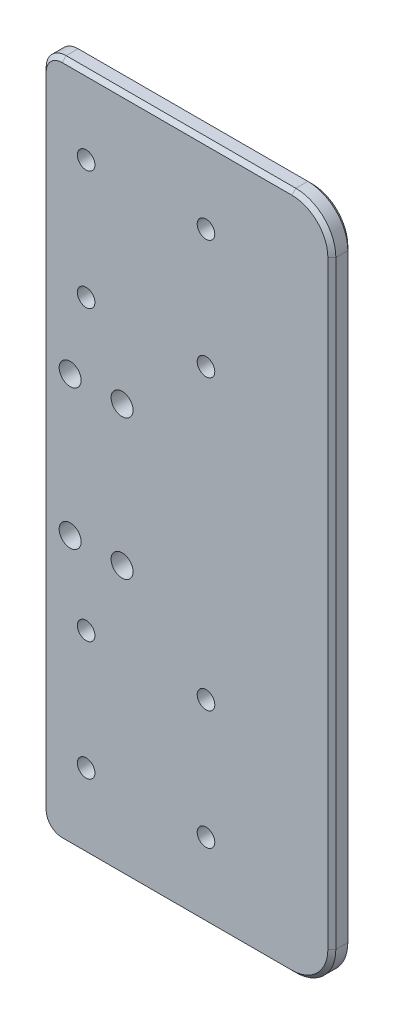
ISO-10303-21;
HEADER;
FILE_DESCRIPTION(('STEP AP214'),'2;1');
FILE_NAME('part.step','',(''),(''),'','','');
FILE_SCHEMA(('AUTOMOTIVE_DESIGN { 1 0 10303 214 1 1 1 1 }'));
ENDSEC;
DATA;
#1=APPLICATION_CONTEXT('core data for automotive mechanical design processes');
#2=APPLICATION_PROTOCOL_DEFINITION('international standard','automotive_design',2000,#1);
#3=PRODUCT_CONTEXT('',#1,'mechanical');
#4=PRODUCT('Part','Part','',(#3));
#5=PRODUCT_RELATED_PRODUCT_CATEGORY('part','',(#4));
#6=PRODUCT_DEFINITION_FORMATION('','',#4);
#7=PRODUCT_DEFINITION_CONTEXT('part definition',#1,'design');
#8=PRODUCT_DEFINITION('design','',#6,#7);
#9=PRODUCT_DEFINITION_SHAPE('','',#8);
#10=(LENGTH_UNIT() NAMED_UNIT(*) SI_UNIT(.MILLI.,.METRE.));
#11=(NAMED_UNIT(*) PLANE_ANGLE_UNIT() SI_UNIT($,.RADIAN.));
#12=(NAMED_UNIT(*) SI_UNIT($,.STERADIAN.) SOLID_ANGLE_UNIT());
#13=UNCERTAINTY_MEASURE_WITH_UNIT(LENGTH_MEASURE(1.E-05),#10,'distance_accuracy_value','');
#14=(GEOMETRIC_REPRESENTATION_CONTEXT(3) GLOBAL_UNCERTAINTY_ASSIGNED_CONTEXT((#13)) GLOBAL_UNIT_ASSIGNED_CONTEXT((#10,
#11,#12)) REPRESENTATION_CONTEXT('',''));
#15=CARTESIAN_POINT('',(0.,0.,0.));
#16=DIRECTION('',(0.,0.,1.));
#17=DIRECTION('',(1.,0.,0.));
#18=AXIS2_PLACEMENT_3D('',#15,#16,#17);
#19=CARTESIAN_POINT('',(234.824487649167,0.,-5.));
#20=DIRECTION('',(-1.,0.,0.));
#21=DIRECTION('',(0.,0.,1.));
#22=AXIS2_PLACEMENT_3D('',#19,#20,#21);
#23=PLANE('',#22);
#24=DIRECTION('',(0.,0.,1.));
#25=VECTOR('',#24,1.);
#26=CARTESIAN_POINT('',(234.824487649167,-3.00000303575964,-5.));
#27=LINE('',#26,#25);
#28=CARTESIAN_POINT('',(234.824487649167,-3.00000303575964,-4.));
#29=VERTEX_POINT('',#28);
#30=CARTESIAN_POINT('',(234.824487649167,-3.00000303575964,-1.));
#31=VERTEX_POINT('',#30);
#32=EDGE_CURVE('E323',#29,#31,#27,.T.);
#33=ORIENTED_EDGE('',*,*,#32,.T.);
#34=DIRECTION('',(0.,-1.,0.));
#35=VECTOR('',#34,1.);
#36=CARTESIAN_POINT('',(234.824487649167,-152.999988315742,-1.));
#37=LINE('',#36,#35);
#38=CARTESIAN_POINT('',(234.824487649167,-152.999988315742,-1.));
#39=VERTEX_POINT('',#38);
#40=EDGE_CURVE('E384',#31,#39,#37,.T.);
#41=ORIENTED_EDGE('',*,*,#40,.T.);
#42=DIRECTION('',(0.,0.,1.));
#43=VECTOR('',#42,1.);
#44=CARTESIAN_POINT('',(234.824487649167,-152.999988315742,-5.));
#45=LINE('',#44,#43);
#46=CARTESIAN_POINT('',(234.824487649167,-152.999988315742,-4.));
#47=VERTEX_POINT('',#46);
#48=EDGE_CURVE('E188',#47,#39,#45,.T.);
#49=ORIENTED_EDGE('',*,*,#48,.F.);
#50=DIRECTION('',(0.,1.,0.));
#51=VECTOR('',#50,1.);
#52=CARTESIAN_POINT('',(234.824487649167,0.,-4.));
#53=LINE('',#52,#51);
#54=EDGE_CURVE('E382',#47,#29,#53,.T.);
#55=ORIENTED_EDGE('',*,*,#54,.T.);
#56=EDGE_LOOP('',(#33,#41,#49,#55));
#57=FACE_BOUND('',#56,.T.);
#58=ADVANCED_FACE('F44',(#57),#23,.F.);
#59=CARTESIAN_POINT('',(224.824487649167,-152.999988315742,-5.));
#60=DIRECTION('',(0.,0.,1.));
#61=DIRECTION('',(1.,0.,0.));
#62=AXIS2_PLACEMENT_3D('',#59,#60,#61);
#63=CYLINDRICAL_SURFACE('',#62,10.);
#64=ORIENTED_EDGE('',*,*,#48,.T.);
#65=CARTESIAN_POINT('',(224.824487649167,-152.999988315742,-1.));
#66=DIRECTION('',(0.,0.,1.));
#67=DIRECTION('',(1.,0.,0.));
#68=AXIS2_PLACEMENT_3D('',#65,#66,#67);
#69=CIRCLE('',#68,10.);
#70=CARTESIAN_POINT('',(224.824489681212,-162.999988315742,-1.));
#71=VERTEX_POINT('',#70);
#72=EDGE_CURVE('E378',#39,#71,#69,.F.);
#73=ORIENTED_EDGE('',*,*,#72,.T.);
#74=DIRECTION('',(0.,0.,1.));
#75=VECTOR('',#74,1.);
#76=CARTESIAN_POINT('',(224.824489681212,-162.999988315742,-5.));
#77=LINE('',#76,#75);
#78=CARTESIAN_POINT('',(224.824489681212,-162.999988315742,-4.));
#79=VERTEX_POINT('',#78);
#80=EDGE_CURVE('E327',#79,#71,#77,.T.);
#81=ORIENTED_EDGE('',*,*,#80,.F.);
#82=CARTESIAN_POINT('',(224.824487649167,-152.999988315742,-4.));
#83=DIRECTION('',(0.,0.,1.));
#84=DIRECTION('',(1.,0.,0.));
#85=AXIS2_PLACEMENT_3D('',#82,#83,#84);
#86=CIRCLE('',#85,10.);
#87=EDGE_CURVE('E380',#79,#47,#86,.T.);
#88=ORIENTED_EDGE('',*,*,#87,.T.);
#89=EDGE_LOOP('',(#64,#73,#81,#88));
#90=FACE_BOUND('',#89,.T.);
#91=ADVANCED_FACE('F444',(#90),#63,.T.);
#92=CARTESIAN_POINT('',(3.31223389725105E-05,-163.000034001081,-5.));
#93=DIRECTION('',(-2.03204491186119E-07,0.999999999999979,0.));
#94=DIRECTION('',(-0.999999999999979,-2.03204491186119E-07,0.));
#95=AXIS2_PLACEMENT_3D('',#92,#93,#94);
#96=PLANE('',#95);
#97=ORIENTED_EDGE('',*,*,#80,.T.);
#98=DIRECTION('',(-0.999999999999979,-2.03204491186119E-07,0.));
#99=VECTOR('',#98,1.);
#100=CARTESIAN_POINT('',(167.32448866519,-163.,-1.));
#101=LINE('',#100,#99);
#102=CARTESIAN_POINT('',(167.32448866519,-163.,-1.));
#103=VERTEX_POINT('',#102);
#104=EDGE_CURVE('E371',#71,#103,#101,.T.);
#105=ORIENTED_EDGE('',*,*,#104,.T.);
#106=DIRECTION('',(0.,0.,1.));
#107=VECTOR('',#106,1.);
#108=CARTESIAN_POINT('',(167.32448866519,-163.,-5.));
#109=LINE('',#108,#107);
#110=CARTESIAN_POINT('',(167.32448866519,-163.,-4.));
#111=VERTEX_POINT('',#110);
#112=EDGE_CURVE('E334',#111,#103,#109,.T.);
#113=ORIENTED_EDGE('',*,*,#112,.F.);
#114=DIRECTION('',(0.999999999999979,2.03204491186119E-07,0.));
#115=VECTOR('',#114,1.);
#116=CARTESIAN_POINT('',(3.31223389725105E-05,-163.000034001081,-4.));
#117=LINE('',#116,#115);
#118=EDGE_CURVE('E367',#111,#79,#117,.T.);
#119=ORIENTED_EDGE('',*,*,#118,.T.);
#120=EDGE_LOOP('',(#97,#105,#113,#119));
#121=FACE_BOUND('',#120,.T.);
#122=ADVANCED_FACE('F420',(#121),#96,.F.);
#123=CARTESIAN_POINT('',(167.324487649167,-158.,-5.));
#124=DIRECTION('',(0.,0.,1.));
#125=DIRECTION('',(1.,0.,0.));
#126=AXIS2_PLACEMENT_3D('',#123,#124,#125);
#127=CYLINDRICAL_SURFACE('',#126,5.);
#128=ORIENTED_EDGE('',*,*,#112,.T.);
#129=CARTESIAN_POINT('',(167.324487649167,-158.,-1.));
#130=DIRECTION('',(0.,0.,1.));
#131=DIRECTION('',(1.,0.,0.));
#132=AXIS2_PLACEMENT_3D('',#129,#130,#131);
#133=CIRCLE('',#132,5.);
#134=CARTESIAN_POINT('',(162.324487649167,-158.,-1.));
#135=VERTEX_POINT('',#134);
#136=EDGE_CURVE('E361',#103,#135,#133,.F.);
#137=ORIENTED_EDGE('',*,*,#136,.T.);
#138=DIRECTION('',(0.,0.,1.));
#139=VECTOR('',#138,1.);
#140=CARTESIAN_POINT('',(162.324487649167,-158.,-5.));
#141=LINE('',#140,#139);
#142=CARTESIAN_POINT('',(162.324487649167,-158.,-4.));
#143=VERTEX_POINT('',#142);
#144=EDGE_CURVE('E184',#143,#135,#141,.T.);
#145=ORIENTED_EDGE('',*,*,#144,.F.);
#146=CARTESIAN_POINT('',(167.324487649167,-158.,-4.));
#147=DIRECTION('',(0.,0.,1.));
#148=DIRECTION('',(1.,0.,0.));
#149=AXIS2_PLACEMENT_3D('',#146,#147,#148);
#150=CIRCLE('',#149,5.);
#151=EDGE_CURVE('E363',#143,#111,#150,.T.);
#152=ORIENTED_EDGE('',*,*,#151,.T.);
#153=EDGE_LOOP('',(#128,#137,#145,#152));
#154=FACE_BOUND('',#153,.T.);
#155=ADVANCED_FACE('F417',(#154),#127,.T.);
#156=CARTESIAN_POINT('',(162.324487649167,0.,-5.));
#157=DIRECTION('',(1.,0.,0.));
#158=DIRECTION('',(0.,0.,-1.));
#159=AXIS2_PLACEMENT_3D('',#156,#157,#158);
#160=PLANE('',#159);
#161=ORIENTED_EDGE('',*,*,#144,.T.);
#162=DIRECTION('',(0.,1.,0.));
#163=VECTOR('',#162,1.);
#164=CARTESIAN_POINT('',(162.324487649167,1.99999999999995,-1.));
#165=LINE('',#164,#163);
#166=CARTESIAN_POINT('',(162.324487649167,1.99999999999995,-1.));
#167=VERTEX_POINT('',#166);
#168=EDGE_CURVE('E183',#135,#167,#165,.T.);
#169=ORIENTED_EDGE('',*,*,#168,.T.);
#170=DIRECTION('',(0.,0.,1.));
#171=VECTOR('',#170,1.);
#172=CARTESIAN_POINT('',(162.324487649167,1.99999999999995,-5.));
#173=LINE('',#172,#171);
#174=CARTESIAN_POINT('',(162.324487649167,1.99999999999995,-4.));
#175=VERTEX_POINT('',#174);
#176=EDGE_CURVE('E170',#175,#167,#173,.T.);
#177=ORIENTED_EDGE('',*,*,#176,.F.);
#178=DIRECTION('',(0.,-1.,0.));
#179=VECTOR('',#178,1.);
#180=CARTESIAN_POINT('',(162.324487649167,0.,-4.));
#181=LINE('',#180,#179);
#182=EDGE_CURVE('E181',#175,#143,#181,.T.);
#183=ORIENTED_EDGE('',*,*,#182,.T.);
#184=EDGE_LOOP('',(#161,#169,#177,#183));
#185=FACE_BOUND('',#184,.T.);
#186=ADVANCED_FACE('F179',(#185),#160,.F.);
#187=CARTESIAN_POINT('',(167.324487649167,1.99999999999995,-5.));
#188=DIRECTION('',(0.,0.,1.));
#189=DIRECTION('',(1.,0.,0.));
#190=AXIS2_PLACEMENT_3D('',#187,#188,#189);
#191=CYLINDRICAL_SURFACE('',#190,5.);
#192=ORIENTED_EDGE('',*,*,#176,.T.);
#193=CARTESIAN_POINT('',(167.324487649167,1.99999999999995,-1.));
#194=DIRECTION('',(0.,0.,1.));
#195=DIRECTION('',(1.,0.,0.));
#196=AXIS2_PLACEMENT_3D('',#193,#194,#195);
#197=CIRCLE('',#196,5.);
#198=CARTESIAN_POINT('',(167.324487913146,6.99999999999995,-1.));
#199=VERTEX_POINT('',#198);
#200=EDGE_CURVE('E173',#167,#199,#197,.F.);
#201=ORIENTED_EDGE('',*,*,#200,.T.);
#202=DIRECTION('',(0.,0.,1.));
#203=VECTOR('',#202,1.);
#204=CARTESIAN_POINT('',(167.324487913146,6.99999999999995,-5.));
#205=LINE('',#204,#203);
#206=CARTESIAN_POINT('',(167.324487913146,6.99999999999995,-4.));
#207=VERTEX_POINT('',#206);
#208=EDGE_CURVE('E169',#207,#199,#205,.T.);
#209=ORIENTED_EDGE('',*,*,#208,.F.);
#210=CARTESIAN_POINT('',(167.324487649167,1.99999999999995,-4.));
#211=DIRECTION('',(0.,0.,1.));
#212=DIRECTION('',(1.,0.,0.));
#213=AXIS2_PLACEMENT_3D('',#210,#211,#212);
#214=CIRCLE('',#213,5.);
#215=EDGE_CURVE('E165',#207,#175,#214,.T.);
#216=ORIENTED_EDGE('',*,*,#215,.T.);
#217=EDGE_LOOP('',(#192,#201,#209,#216));
#218=FACE_BOUND('',#217,.T.);
#219=ADVANCED_FACE('F168',(#218),#191,.T.);
#220=CARTESIAN_POINT('',(3.69571190522047E-07,7.00000883403309,-5.));
#221=DIRECTION('',(-5.27958177317208E-08,-0.999999999999999,0.));
#222=DIRECTION('',(0.999999999999999,-5.27958177317208E-08,0.));
#223=AXIS2_PLACEMENT_3D('',#220,#221,#222);
#224=PLANE('',#223);
#225=ORIENTED_EDGE('',*,*,#208,.T.);
#226=DIRECTION('',(0.999999999999999,-5.27958177317208E-08,0.));
#227=VECTOR('',#226,1.);
#228=CARTESIAN_POINT('',(224.824488177125,6.99999696424041,-1.));
#229=LINE('',#228,#227);
#230=CARTESIAN_POINT('',(224.824488177125,6.99999696424041,-1.));
#231=VERTEX_POINT('',#230);
#232=EDGE_CURVE('E370',#199,#231,#229,.T.);
#233=ORIENTED_EDGE('',*,*,#232,.T.);
#234=DIRECTION('',(0.,0.,1.));
#235=VECTOR('',#234,1.);
#236=CARTESIAN_POINT('',(224.824488177125,6.99999696424041,-5.));
#237=LINE('',#236,#235);
#238=CARTESIAN_POINT('',(224.824488177125,6.99999696424041,-4.));
#239=VERTEX_POINT('',#238);
#240=EDGE_CURVE('E336',#239,#231,#237,.T.);
#241=ORIENTED_EDGE('',*,*,#240,.F.);
#242=DIRECTION('',(-0.999999999999999,5.27958177317208E-08,0.));
#243=VECTOR('',#242,1.);
#244=CARTESIAN_POINT('',(3.69571190522047E-07,7.00000883403309,-4.));
#245=LINE('',#244,#243);
#246=EDGE_CURVE('E362',#239,#207,#245,.T.);
#247=ORIENTED_EDGE('',*,*,#246,.T.);
#248=EDGE_LOOP('',(#225,#233,#241,#247));
#249=FACE_BOUND('',#248,.T.);
#250=ADVANCED_FACE('F456',(#249),#224,.F.);
#251=CARTESIAN_POINT('',(224.824487649167,-3.00000303575957,-5.));
#252=DIRECTION('',(0.,0.,1.));
#253=DIRECTION('',(1.,0.,0.));
#254=AXIS2_PLACEMENT_3D('',#251,#252,#253);
#255=CYLINDRICAL_SURFACE('',#254,10.);
#256=ORIENTED_EDGE('',*,*,#240,.T.);
#257=CARTESIAN_POINT('',(224.824487649167,-3.00000303575957,-1.));
#258=DIRECTION('',(0.,0.,1.));
#259=DIRECTION('',(1.,0.,0.));
#260=AXIS2_PLACEMENT_3D('',#257,#258,#259);
#261=CIRCLE('',#260,10.);
#262=EDGE_CURVE('E374',#231,#31,#261,.F.);
#263=ORIENTED_EDGE('',*,*,#262,.T.);
#264=ORIENTED_EDGE('',*,*,#32,.F.);
#265=CARTESIAN_POINT('',(224.824487649167,-3.00000303575957,-4.));
#266=DIRECTION('',(0.,0.,1.));
#267=DIRECTION('',(1.,0.,0.));
#268=AXIS2_PLACEMENT_3D('',#265,#266,#267);
#269=CIRCLE('',#268,10.);
#270=EDGE_CURVE('E373',#29,#239,#269,.T.);
#271=ORIENTED_EDGE('',*,*,#270,.T.);
#272=EDGE_LOOP('',(#256,#263,#264,#271));
#273=FACE_BOUND('',#272,.T.);
#274=ADVANCED_FACE('F451',(#273),#255,.T.);
#275=CARTESIAN_POINT('',(0.,0.,-5.));
#276=DIRECTION('',(0.,0.,1.));
#277=DIRECTION('',(1.,0.,0.));
#278=AXIS2_PLACEMENT_3D('',#275,#276,#277);
#279=PLANE('',#278);
#280=CARTESIAN_POINT('',(167.324487649167,-158.,-5.));
#281=DIRECTION('',(0.,0.,1.));
#282=DIRECTION('',(1.,0.,0.));
#283=AXIS2_PLACEMENT_3D('',#280,#281,#282);
#284=CIRCLE('',#283,4.);
#285=CARTESIAN_POINT('',(167.324488461985,-162.,-5.));
#286=VERTEX_POINT('',#285);
#287=CARTESIAN_POINT('',(163.324487649167,-158.,-5.));
#288=VERTEX_POINT('',#287);
#289=EDGE_CURVE('E67',#286,#288,#284,.F.);
#290=ORIENTED_EDGE('',*,*,#289,.T.);
#291=DIRECTION('',(0.,1.,0.));
#292=VECTOR('',#291,1.);
#293=CARTESIAN_POINT('',(163.324487649167,0.,-5.));
#294=LINE('',#293,#292);
#295=CARTESIAN_POINT('',(163.324487649167,1.99999999999995,-5.));
#296=VERTEX_POINT('',#295);
#297=EDGE_CURVE('E11',#288,#296,#294,.T.);
#298=ORIENTED_EDGE('',*,*,#297,.T.);
#299=CARTESIAN_POINT('',(167.324487649167,1.99999999999995,-5.));
#300=DIRECTION('',(0.,0.,1.));
#301=DIRECTION('',(1.,0.,0.));
#302=AXIS2_PLACEMENT_3D('',#299,#300,#301);
#303=CIRCLE('',#302,4.);
#304=CARTESIAN_POINT('',(167.324487860351,5.99999999999995,-5.));
#305=VERTEX_POINT('',#304);
#306=EDGE_CURVE('E54',#296,#305,#303,.F.);
#307=ORIENTED_EDGE('',*,*,#306,.T.);
#308=DIRECTION('',(0.999999999999999,-5.27958177317208E-08,0.));
#309=VECTOR('',#308,1.);
#310=CARTESIAN_POINT('',(3.16775372790326E-07,6.00000883403309,-5.));
#311=LINE('',#310,#309);
#312=CARTESIAN_POINT('',(224.824488124329,5.99999696424042,-5.));
#313=VERTEX_POINT('',#312);
#314=EDGE_CURVE('E395',#305,#313,#311,.T.);
#315=ORIENTED_EDGE('',*,*,#314,.T.);
#316=CARTESIAN_POINT('',(224.824487649167,-3.00000303575957,-5.));
#317=DIRECTION('',(0.,0.,1.));
#318=DIRECTION('',(1.,0.,0.));
#319=AXIS2_PLACEMENT_3D('',#316,#317,#318);
#320=CIRCLE('',#319,9.00000000000001);
#321=CARTESIAN_POINT('',(233.824487649167,-3.00000303575964,-5.));
#322=VERTEX_POINT('',#321);
#323=EDGE_CURVE('E386',#313,#322,#320,.F.);
#324=ORIENTED_EDGE('',*,*,#323,.T.);
#325=DIRECTION('',(0.,-1.,0.));
#326=VECTOR('',#325,1.);
#327=CARTESIAN_POINT('',(233.824487649167,0.,-5.));
#328=LINE('',#327,#326);
#329=CARTESIAN_POINT('',(233.824487649167,-152.999988315742,-5.));
#330=VERTEX_POINT('',#329);
#331=EDGE_CURVE('E383',#322,#330,#328,.T.);
#332=ORIENTED_EDGE('',*,*,#331,.T.);
#333=CARTESIAN_POINT('',(224.824487649167,-152.999988315742,-5.));
#334=DIRECTION('',(0.,0.,1.));
#335=DIRECTION('',(1.,0.,0.));
#336=AXIS2_PLACEMENT_3D('',#333,#334,#335);
#337=CIRCLE('',#336,9.);
#338=CARTESIAN_POINT('',(224.824489478008,-161.999988315742,-5.));
#339=VERTEX_POINT('',#338);
#340=EDGE_CURVE('E390',#330,#339,#337,.F.);
#341=ORIENTED_EDGE('',*,*,#340,.T.);
#342=DIRECTION('',(-0.999999999999979,-2.03204491186119E-07,0.));
#343=VECTOR('',#342,1.);
#344=CARTESIAN_POINT('',(3.29191344813243E-05,-162.000034001081,-5.));
#345=LINE('',#344,#343);
#346=EDGE_CURVE('E394',#339,#286,#345,.T.);
#347=ORIENTED_EDGE('',*,*,#346,.T.);
#348=EDGE_LOOP('',(#290,#298,#307,#315,#324,#332,#341,#347));
#349=FACE_BOUND('',#348,.T.);
#350=CARTESIAN_POINT('',(203.324487649168,-143.9,-5.));
#351=DIRECTION('',(0.,0.,1.));
#352=DIRECTION('',(1.,0.,0.));
#353=AXIS2_PLACEMENT_3D('',#350,#351,#352);
#354=CIRCLE('',#353,2.19999999999999);
#355=CARTESIAN_POINT('',(205.524487649168,-143.9,-5.));
#356=VERTEX_POINT('',#355);
#357=EDGE_CURVE('E290',#356,#356,#354,.T.);
#358=ORIENTED_EDGE('',*,*,#357,.T.);
#359=EDGE_LOOP('',(#358));
#360=FACE_BOUND('',#359,.T.);
#361=CARTESIAN_POINT('',(173.324487649168,-114.1,-5.));
#362=DIRECTION('',(0.,0.,1.));
#363=DIRECTION('',(1.,0.,0.));
#364=AXIS2_PLACEMENT_3D('',#361,#362,#363);
#365=CIRCLE('',#364,2.19999999999998);
#366=CARTESIAN_POINT('',(175.524487649168,-114.1,-5.));
#367=VERTEX_POINT('',#366);
#368=EDGE_CURVE('E280',#367,#367,#365,.T.);
#369=ORIENTED_EDGE('',*,*,#368,.T.);
#370=EDGE_LOOP('',(#369));
#371=FACE_BOUND('',#370,.T.);
#372=CARTESIAN_POINT('',(203.324487649168,-114.1,-5.));
#373=DIRECTION('',(0.,0.,1.));
#374=DIRECTION('',(1.,0.,0.));
#375=AXIS2_PLACEMENT_3D('',#372,#373,#374);
#376=CIRCLE('',#375,2.20000000000001);
#377=CARTESIAN_POINT('',(205.524487649168,-114.1,-5.));
#378=VERTEX_POINT('',#377);
#379=EDGE_CURVE('E279',#378,#378,#376,.T.);
#380=ORIENTED_EDGE('',*,*,#379,.T.);
#381=EDGE_LOOP('',(#380));
#382=FACE_BOUND('',#381,.T.);
#383=CARTESIAN_POINT('',(169.324487649167,-60.5000000000001,-5.));
#384=DIRECTION('',(0.,0.,1.));
#385=DIRECTION('',(1.,0.,0.));
#386=AXIS2_PLACEMENT_3D('',#383,#384,#385);
#387=CIRCLE('',#386,2.75000000000001);
#388=CARTESIAN_POINT('',(172.074487649167,-60.5000000000001,-5.));
#389=VERTEX_POINT('',#388);
#390=EDGE_CURVE('E262',#389,#389,#387,.T.);
#391=ORIENTED_EDGE('',*,*,#390,.T.);
#392=EDGE_LOOP('',(#391));
#393=FACE_BOUND('',#392,.T.);
#394=CARTESIAN_POINT('',(173.324487649167,-12.0999999999999,-5.));
#395=DIRECTION('',(0.,0.,1.));
#396=DIRECTION('',(1.,0.,0.));
#397=AXIS2_PLACEMENT_3D('',#394,#395,#396);
#398=CIRCLE('',#397,2.20000000000001);
#399=CARTESIAN_POINT('',(175.524487649167,-12.0999999999999,-5.));
#400=VERTEX_POINT('',#399);
#401=EDGE_CURVE('E313',#400,#400,#398,.T.);
#402=ORIENTED_EDGE('',*,*,#401,.T.);
#403=EDGE_LOOP('',(#402));
#404=FACE_BOUND('',#403,.T.);
#405=CARTESIAN_POINT('',(173.324487649167,-41.8999999999999,-5.));
#406=DIRECTION('',(0.,0.,1.));
#407=DIRECTION('',(1.,0.,0.));
#408=AXIS2_PLACEMENT_3D('',#405,#406,#407);
#409=CIRCLE('',#408,2.20000000000001);
#410=CARTESIAN_POINT('',(175.524487649167,-41.8999999999999,-5.));
#411=VERTEX_POINT('',#410);
#412=EDGE_CURVE('E301',#411,#411,#409,.T.);
#413=ORIENTED_EDGE('',*,*,#412,.T.);
#414=EDGE_LOOP('',(#413));
#415=FACE_BOUND('',#414,.T.);
#416=CARTESIAN_POINT('',(203.324487649167,-41.8999999999999,-5.));
#417=DIRECTION('',(0.,0.,1.));
#418=DIRECTION('',(1.,0.,0.));
#419=AXIS2_PLACEMENT_3D('',#416,#417,#418);
#420=CIRCLE('',#419,2.19999999999999);
#421=CARTESIAN_POINT('',(205.524487649167,-41.8999999999999,-5.));
#422=VERTEX_POINT('',#421);
#423=EDGE_CURVE('E305',#422,#422,#420,.T.);
#424=ORIENTED_EDGE('',*,*,#423,.T.);
#425=EDGE_LOOP('',(#424));
#426=FACE_BOUND('',#425,.T.);
#427=CARTESIAN_POINT('',(173.324487649168,-143.9,-5.));
#428=DIRECTION('',(0.,0.,1.));
#429=DIRECTION('',(1.,0.,0.));
#430=AXIS2_PLACEMENT_3D('',#427,#428,#429);
#431=CIRCLE('',#430,2.19999999999999);
#432=CARTESIAN_POINT('',(175.524487649168,-143.9,-5.));
#433=VERTEX_POINT('',#432);
#434=EDGE_CURVE('E288',#433,#433,#431,.T.);
#435=ORIENTED_EDGE('',*,*,#434,.T.);
#436=EDGE_LOOP('',(#435));
#437=FACE_BOUND('',#436,.T.);
#438=CARTESIAN_POINT('',(182.324487649167,-95.5000000000001,-5.));
#439=DIRECTION('',(0.,0.,1.));
#440=DIRECTION('',(1.,0.,0.));
#441=AXIS2_PLACEMENT_3D('',#438,#439,#440);
#442=CIRCLE('',#441,2.75000000000001);
#443=CARTESIAN_POINT('',(185.074487649167,-95.5000000000001,-5.));
#444=VERTEX_POINT('',#443);
#445=EDGE_CURVE('E247',#444,#444,#442,.T.);
#446=ORIENTED_EDGE('',*,*,#445,.T.);
#447=EDGE_LOOP('',(#446));
#448=FACE_BOUND('',#447,.T.);
#449=CARTESIAN_POINT('',(182.324487649167,-60.5000000000001,-5.));
#450=DIRECTION('',(0.,0.,1.));
#451=DIRECTION('',(1.,0.,0.));
#452=AXIS2_PLACEMENT_3D('',#449,#450,#451);
#453=CIRCLE('',#452,2.74999999999998);
#454=CARTESIAN_POINT('',(185.074487649167,-60.5000000000001,-5.));
#455=VERTEX_POINT('',#454);
#456=EDGE_CURVE('E256',#455,#455,#453,.T.);
#457=ORIENTED_EDGE('',*,*,#456,.T.);
#458=EDGE_LOOP('',(#457));
#459=FACE_BOUND('',#458,.T.);
#460=CARTESIAN_POINT('',(169.324487649167,-95.5000000000001,-5.));
#461=DIRECTION('',(0.,0.,1.));
#462=DIRECTION('',(1.,0.,0.));
#463=AXIS2_PLACEMENT_3D('',#460,#461,#462);
#464=CIRCLE('',#463,2.74999999999998);
#465=CARTESIAN_POINT('',(172.074487649167,-95.5000000000001,-5.));
#466=VERTEX_POINT('',#465);
#467=EDGE_CURVE('E266',#466,#466,#464,.T.);
#468=ORIENTED_EDGE('',*,*,#467,.T.);
#469=EDGE_LOOP('',(#468));
#470=FACE_BOUND('',#469,.T.);
#471=CARTESIAN_POINT('',(203.324487649167,-12.0999999999999,-5.));
#472=DIRECTION('',(0.,0.,1.));
#473=DIRECTION('',(1.,0.,0.));
#474=AXIS2_PLACEMENT_3D('',#471,#472,#473);
#475=CIRCLE('',#474,2.19999999999998);
#476=CARTESIAN_POINT('',(205.524487649167,-12.0999999999999,-5.));
#477=VERTEX_POINT('',#476);
#478=EDGE_CURVE('E325',#477,#477,#475,.T.);
#479=ORIENTED_EDGE('',*,*,#478,.T.);
#480=EDGE_LOOP('',(#479));
#481=FACE_BOUND('',#480,.T.);
#482=ADVANCED_FACE('F396',(#349,#360,#371,#382,#393,#404,#415,#426,#437,#448,#459,#470,#481),
#279,.F.);
#483=CARTESIAN_POINT('',(0.,0.,0.));
#484=DIRECTION('',(0.,0.,1.));
#485=DIRECTION('',(1.,0.,0.));
#486=AXIS2_PLACEMENT_3D('',#483,#484,#485);
#487=PLANE('',#486);
#488=CARTESIAN_POINT('',(167.324487649167,1.99999999999995,0.));
#489=DIRECTION('',(0.,0.,1.));
#490=DIRECTION('',(1.,0.,0.));
#491=AXIS2_PLACEMENT_3D('',#488,#489,#490);
#492=CIRCLE('',#491,4.);
#493=CARTESIAN_POINT('',(167.324487860351,5.99999999999995,0.));
#494=VERTEX_POINT('',#493);
#495=CARTESIAN_POINT('',(163.324487649167,1.99999999999995,0.));
#496=VERTEX_POINT('',#495);
#497=EDGE_CURVE('E358',#494,#496,#492,.T.);
#498=ORIENTED_EDGE('',*,*,#497,.T.);
#499=DIRECTION('',(0.,-1.,0.));
#500=VECTOR('',#499,1.);
#501=CARTESIAN_POINT('',(163.324487649167,-158.,0.));
#502=LINE('',#501,#500);
#503=CARTESIAN_POINT('',(163.324487649167,-158.,0.));
#504=VERTEX_POINT('',#503);
#505=EDGE_CURVE('E172',#496,#504,#502,.T.);
#506=ORIENTED_EDGE('',*,*,#505,.T.);
#507=CARTESIAN_POINT('',(167.324487649167,-158.,0.));
#508=DIRECTION('',(0.,0.,1.));
#509=DIRECTION('',(1.,0.,0.));
#510=AXIS2_PLACEMENT_3D('',#507,#508,#509);
#511=CIRCLE('',#510,4.);
#512=CARTESIAN_POINT('',(167.324488461985,-162.,0.));
#513=VERTEX_POINT('',#512);
#514=EDGE_CURVE('E353',#504,#513,#511,.T.);
#515=ORIENTED_EDGE('',*,*,#514,.T.);
#516=DIRECTION('',(0.999999999999979,2.03204491186119E-07,0.));
#517=VECTOR('',#516,1.);
#518=CARTESIAN_POINT('',(224.824489478007,-161.999988315742,0.));
#519=LINE('',#518,#517);
#520=CARTESIAN_POINT('',(224.824489478008,-161.999988315742,0.));
#521=VERTEX_POINT('',#520);
#522=EDGE_CURVE('E347',#513,#521,#519,.T.);
#523=ORIENTED_EDGE('',*,*,#522,.T.);
#524=CARTESIAN_POINT('',(224.824487649167,-152.999988315742,0.));
#525=DIRECTION('',(0.,0.,1.));
#526=DIRECTION('',(1.,0.,0.));
#527=AXIS2_PLACEMENT_3D('',#524,#525,#526);
#528=CIRCLE('',#527,9.00000000000001);
#529=CARTESIAN_POINT('',(233.824487649167,-152.999988315742,0.));
#530=VERTEX_POINT('',#529);
#531=EDGE_CURVE('E349',#521,#530,#528,.T.);
#532=ORIENTED_EDGE('',*,*,#531,.T.);
#533=DIRECTION('',(0.,1.,0.));
#534=VECTOR('',#533,1.);
#535=CARTESIAN_POINT('',(233.824487649167,-3.00000303575964,0.));
#536=LINE('',#535,#534);
#537=CARTESIAN_POINT('',(233.824487649167,-3.00000303575964,0.));
#538=VERTEX_POINT('',#537);
#539=EDGE_CURVE('E341',#530,#538,#536,.T.);
#540=ORIENTED_EDGE('',*,*,#539,.T.);
#541=CARTESIAN_POINT('',(224.824487649167,-3.00000303575957,0.));
#542=DIRECTION('',(0.,0.,1.));
#543=DIRECTION('',(1.,0.,0.));
#544=AXIS2_PLACEMENT_3D('',#541,#542,#543);
#545=CIRCLE('',#544,9.00000000000001);
#546=CARTESIAN_POINT('',(224.824488124329,5.99999696424042,0.));
#547=VERTEX_POINT('',#546);
#548=EDGE_CURVE('E350',#538,#547,#545,.T.);
#549=ORIENTED_EDGE('',*,*,#548,.T.);
#550=DIRECTION('',(-0.999999999999999,5.27958177317208E-08,0.));
#551=VECTOR('',#550,1.);
#552=CARTESIAN_POINT('',(167.324487860351,5.99999999999995,0.));
#553=LINE('',#552,#551);
#554=EDGE_CURVE('E352',#547,#494,#553,.T.);
#555=ORIENTED_EDGE('',*,*,#554,.T.);
#556=EDGE_LOOP('',(#498,#506,#515,#523,#532,#540,#549,#555));
#557=FACE_BOUND('',#556,.T.);
#558=CARTESIAN_POINT('',(203.324487649168,-143.9,0.));
#559=DIRECTION('',(0.,0.,1.));
#560=DIRECTION('',(1.,0.,0.));
#561=AXIS2_PLACEMENT_3D('',#558,#559,#560);
#562=CIRCLE('',#561,2.19999999999999);
#563=CARTESIAN_POINT('',(205.524487649168,-143.9,0.));
#564=VERTEX_POINT('',#563);
#565=EDGE_CURVE('E286',#564,#564,#562,.T.);
#566=ORIENTED_EDGE('',*,*,#565,.F.);
#567=EDGE_LOOP('',(#566));
#568=FACE_BOUND('',#567,.T.);
#569=CARTESIAN_POINT('',(173.324487649168,-114.1,0.));
#570=DIRECTION('',(0.,0.,1.));
#571=DIRECTION('',(1.,0.,0.));
#572=AXIS2_PLACEMENT_3D('',#569,#570,#571);
#573=CIRCLE('',#572,2.19999999999998);
#574=CARTESIAN_POINT('',(175.524487649168,-114.1,0.));
#575=VERTEX_POINT('',#574);
#576=EDGE_CURVE('E291',#575,#575,#573,.T.);
#577=ORIENTED_EDGE('',*,*,#576,.F.);
#578=EDGE_LOOP('',(#577));
#579=FACE_BOUND('',#578,.T.);
#580=CARTESIAN_POINT('',(203.324487649168,-114.1,0.));
#581=DIRECTION('',(0.,0.,1.));
#582=DIRECTION('',(1.,0.,0.));
#583=AXIS2_PLACEMENT_3D('',#580,#581,#582);
#584=CIRCLE('',#583,2.20000000000001);
#585=CARTESIAN_POINT('',(205.524487649168,-114.1,0.));
#586=VERTEX_POINT('',#585);
#587=EDGE_CURVE('E274',#586,#586,#584,.T.);
#588=ORIENTED_EDGE('',*,*,#587,.F.);
#589=EDGE_LOOP('',(#588));
#590=FACE_BOUND('',#589,.T.);
#591=CARTESIAN_POINT('',(169.324487649167,-60.5000000000001,0.));
#592=DIRECTION('',(0.,0.,1.));
#593=DIRECTION('',(1.,0.,0.));
#594=AXIS2_PLACEMENT_3D('',#591,#592,#593);
#595=CIRCLE('',#594,2.75000000000001);
#596=CARTESIAN_POINT('',(172.074487649167,-60.5000000000001,0.));
#597=VERTEX_POINT('',#596);
#598=EDGE_CURVE('E284',#597,#597,#595,.T.);
#599=ORIENTED_EDGE('',*,*,#598,.F.);
#600=EDGE_LOOP('',(#599));
#601=FACE_BOUND('',#600,.T.);
#602=CARTESIAN_POINT('',(173.324487649167,-12.0999999999999,0.));
#603=DIRECTION('',(0.,0.,1.));
#604=DIRECTION('',(1.,0.,0.));
#605=AXIS2_PLACEMENT_3D('',#602,#603,#604);
#606=CIRCLE('',#605,2.20000000000001);
#607=CARTESIAN_POINT('',(175.524487649167,-12.0999999999999,0.));
#608=VERTEX_POINT('',#607);
#609=EDGE_CURVE('E309',#608,#608,#606,.T.);
#610=ORIENTED_EDGE('',*,*,#609,.F.);
#611=EDGE_LOOP('',(#610));
#612=FACE_BOUND('',#611,.T.);
#613=CARTESIAN_POINT('',(173.324487649167,-41.8999999999999,0.));
#614=DIRECTION('',(0.,0.,1.));
#615=DIRECTION('',(1.,0.,0.));
#616=AXIS2_PLACEMENT_3D('',#613,#614,#615);
#617=CIRCLE('',#616,2.20000000000001);
#618=CARTESIAN_POINT('',(175.524487649167,-41.8999999999999,0.));
#619=VERTEX_POINT('',#618);
#620=EDGE_CURVE('E320',#619,#619,#617,.T.);
#621=ORIENTED_EDGE('',*,*,#620,.F.);
#622=EDGE_LOOP('',(#621));
#623=FACE_BOUND('',#622,.T.);
#624=CARTESIAN_POINT('',(203.324487649167,-41.8999999999999,0.));
#625=DIRECTION('',(0.,0.,1.));
#626=DIRECTION('',(1.,0.,0.));
#627=AXIS2_PLACEMENT_3D('',#624,#625,#626);
#628=CIRCLE('',#627,2.19999999999999);
#629=CARTESIAN_POINT('',(205.524487649167,-41.8999999999999,0.));
#630=VERTEX_POINT('',#629);
#631=EDGE_CURVE('E296',#630,#630,#628,.T.);
#632=ORIENTED_EDGE('',*,*,#631,.F.);
#633=EDGE_LOOP('',(#632));
#634=FACE_BOUND('',#633,.T.);
#635=CARTESIAN_POINT('',(173.324487649168,-143.9,0.));
#636=DIRECTION('',(0.,0.,1.));
#637=DIRECTION('',(1.,0.,0.));
#638=AXIS2_PLACEMENT_3D('',#635,#636,#637);
#639=CIRCLE('',#638,2.19999999999999);
#640=CARTESIAN_POINT('',(175.524487649168,-143.9,0.));
#641=VERTEX_POINT('',#640);
#642=EDGE_CURVE('E304',#641,#641,#639,.T.);
#643=ORIENTED_EDGE('',*,*,#642,.F.);
#644=EDGE_LOOP('',(#643));
#645=FACE_BOUND('',#644,.T.);
#646=CARTESIAN_POINT('',(182.324487649167,-95.5000000000001,0.));
#647=DIRECTION('',(0.,0.,1.));
#648=DIRECTION('',(1.,0.,0.));
#649=AXIS2_PLACEMENT_3D('',#646,#647,#648);
#650=CIRCLE('',#649,2.75000000000001);
#651=CARTESIAN_POINT('',(185.074487649167,-95.5000000000001,0.));
#652=VERTEX_POINT('',#651);
#653=EDGE_CURVE('E251',#652,#652,#650,.T.);
#654=ORIENTED_EDGE('',*,*,#653,.F.);
#655=EDGE_LOOP('',(#654));
#656=FACE_BOUND('',#655,.T.);
#657=CARTESIAN_POINT('',(182.324487649167,-60.5000000000001,0.));
#658=DIRECTION('',(0.,0.,1.));
#659=DIRECTION('',(1.,0.,0.));
#660=AXIS2_PLACEMENT_3D('',#657,#658,#659);
#661=CIRCLE('',#660,2.74999999999998);
#662=CARTESIAN_POINT('',(185.074487649167,-60.5000000000001,0.));
#663=VERTEX_POINT('',#662);
#664=EDGE_CURVE('E268',#663,#663,#661,.T.);
#665=ORIENTED_EDGE('',*,*,#664,.F.);
#666=EDGE_LOOP('',(#665));
#667=FACE_BOUND('',#666,.T.);
#668=CARTESIAN_POINT('',(169.324487649167,-95.5000000000001,0.));
#669=DIRECTION('',(0.,0.,1.));
#670=DIRECTION('',(1.,0.,0.));
#671=AXIS2_PLACEMENT_3D('',#668,#669,#670);
#672=CIRCLE('',#671,2.74999999999998);
#673=CARTESIAN_POINT('',(172.074487649167,-95.5000000000001,0.));
#674=VERTEX_POINT('',#673);
#675=EDGE_CURVE('E261',#674,#674,#672,.T.);
#676=ORIENTED_EDGE('',*,*,#675,.F.);
#677=EDGE_LOOP('',(#676));
#678=FACE_BOUND('',#677,.T.);
#679=CARTESIAN_POINT('',(203.324487649167,-12.0999999999999,0.));
#680=DIRECTION('',(0.,0.,1.));
#681=DIRECTION('',(1.,0.,0.));
#682=AXIS2_PLACEMENT_3D('',#679,#680,#681);
#683=CIRCLE('',#682,2.19999999999998);
#684=CARTESIAN_POINT('',(205.524487649167,-12.0999999999999,0.));
#685=VERTEX_POINT('',#684);
#686=EDGE_CURVE('E312',#685,#685,#683,.T.);
#687=ORIENTED_EDGE('',*,*,#686,.F.);
#688=EDGE_LOOP('',(#687));
#689=FACE_BOUND('',#688,.T.);
#690=ADVANCED_FACE('F468',(#557,#568,#579,#590,#601,#612,#623,#634,#645,#656,#667,#678,#689),
#487,.T.);
#691=CARTESIAN_POINT('',(203.324487649167,-12.0999999999999,-5.));
#692=DIRECTION('',(0.,0.,1.));
#693=DIRECTION('',(1.,0.,0.));
#694=AXIS2_PLACEMENT_3D('',#691,#692,#693);
#695=CYLINDRICAL_SURFACE('',#694,2.19999999999998);
#696=ORIENTED_EDGE('',*,*,#478,.F.);
#697=EDGE_LOOP('',(#696));
#698=FACE_BOUND('',#697,.T.);
#699=ORIENTED_EDGE('',*,*,#686,.T.);
#700=EDGE_LOOP('',(#699));
#701=FACE_BOUND('',#700,.T.);
#702=ADVANCED_FACE('F474',(#698,#701),#695,.F.);
#703=CARTESIAN_POINT('',(169.324487649167,-95.5000000000001,-5.));
#704=DIRECTION('',(0.,0.,1.));
#705=DIRECTION('',(1.,0.,0.));
#706=AXIS2_PLACEMENT_3D('',#703,#704,#705);
#707=CYLINDRICAL_SURFACE('',#706,2.74999999999998);
#708=ORIENTED_EDGE('',*,*,#467,.F.);
#709=EDGE_LOOP('',(#708));
#710=FACE_BOUND('',#709,.T.);
#711=ORIENTED_EDGE('',*,*,#675,.T.);
#712=EDGE_LOOP('',(#711));
#713=FACE_BOUND('',#712,.T.);
#714=ADVANCED_FACE('F478',(#710,#713),#707,.F.);
#715=CARTESIAN_POINT('',(182.324487649167,-60.5000000000001,-5.));
#716=DIRECTION('',(0.,0.,1.));
#717=DIRECTION('',(1.,0.,0.));
#718=AXIS2_PLACEMENT_3D('',#715,#716,#717);
#719=CYLINDRICAL_SURFACE('',#718,2.74999999999998);
#720=ORIENTED_EDGE('',*,*,#456,.F.);
#721=EDGE_LOOP('',(#720));
#722=FACE_BOUND('',#721,.T.);
#723=ORIENTED_EDGE('',*,*,#664,.T.);
#724=EDGE_LOOP('',(#723));
#725=FACE_BOUND('',#724,.T.);
#726=ADVANCED_FACE('F511',(#722,#725),#719,.F.);
#727=CARTESIAN_POINT('',(182.324487649167,-95.5000000000001,-5.));
#728=DIRECTION('',(0.,0.,1.));
#729=DIRECTION('',(1.,0.,0.));
#730=AXIS2_PLACEMENT_3D('',#727,#728,#729);
#731=CYLINDRICAL_SURFACE('',#730,2.75000000000001);
#732=ORIENTED_EDGE('',*,*,#445,.F.);
#733=EDGE_LOOP('',(#732));
#734=FACE_BOUND('',#733,.T.);
#735=ORIENTED_EDGE('',*,*,#653,.T.);
#736=EDGE_LOOP('',(#735));
#737=FACE_BOUND('',#736,.T.);
#738=ADVANCED_FACE('F494',(#734,#737),#731,.F.);
#739=CARTESIAN_POINT('',(173.324487649168,-143.9,-5.));
#740=DIRECTION('',(0.,0.,1.));
#741=DIRECTION('',(1.,0.,0.));
#742=AXIS2_PLACEMENT_3D('',#739,#740,#741);
#743=CYLINDRICAL_SURFACE('',#742,2.19999999999999);
#744=ORIENTED_EDGE('',*,*,#434,.F.);
#745=EDGE_LOOP('',(#744));
#746=FACE_BOUND('',#745,.T.);
#747=ORIENTED_EDGE('',*,*,#642,.T.);
#748=EDGE_LOOP('',(#747));
#749=FACE_BOUND('',#748,.T.);
#750=ADVANCED_FACE('F493',(#746,#749),#743,.F.);
#751=CARTESIAN_POINT('',(203.324487649167,-41.8999999999999,-5.));
#752=DIRECTION('',(0.,0.,1.));
#753=DIRECTION('',(1.,0.,0.));
#754=AXIS2_PLACEMENT_3D('',#751,#752,#753);
#755=CYLINDRICAL_SURFACE('',#754,2.19999999999999);
#756=ORIENTED_EDGE('',*,*,#423,.F.);
#757=EDGE_LOOP('',(#756));
#758=FACE_BOUND('',#757,.T.);
#759=ORIENTED_EDGE('',*,*,#631,.T.);
#760=EDGE_LOOP('',(#759));
#761=FACE_BOUND('',#760,.T.);
#762=ADVANCED_FACE('F485',(#758,#761),#755,.F.);
#763=CARTESIAN_POINT('',(173.324487649167,-41.8999999999999,-5.));
#764=DIRECTION('',(0.,0.,1.));
#765=DIRECTION('',(1.,0.,0.));
#766=AXIS2_PLACEMENT_3D('',#763,#764,#765);
#767=CYLINDRICAL_SURFACE('',#766,2.20000000000001);
#768=ORIENTED_EDGE('',*,*,#412,.F.);
#769=EDGE_LOOP('',(#768));
#770=FACE_BOUND('',#769,.T.);
#771=ORIENTED_EDGE('',*,*,#620,.T.);
#772=EDGE_LOOP('',(#771));
#773=FACE_BOUND('',#772,.T.);
#774=ADVANCED_FACE('F481',(#770,#773),#767,.F.);
#775=CARTESIAN_POINT('',(173.324487649167,-12.0999999999999,-5.));
#776=DIRECTION('',(0.,0.,1.));
#777=DIRECTION('',(1.,0.,0.));
#778=AXIS2_PLACEMENT_3D('',#775,#776,#777);
#779=CYLINDRICAL_SURFACE('',#778,2.20000000000001);
#780=ORIENTED_EDGE('',*,*,#401,.F.);
#781=EDGE_LOOP('',(#780));
#782=FACE_BOUND('',#781,.T.);
#783=ORIENTED_EDGE('',*,*,#609,.T.);
#784=EDGE_LOOP('',(#783));
#785=FACE_BOUND('',#784,.T.);
#786=ADVANCED_FACE('F483',(#782,#785),#779,.F.);
#787=CARTESIAN_POINT('',(169.324487649167,-60.5000000000001,-5.));
#788=DIRECTION('',(0.,0.,1.));
#789=DIRECTION('',(1.,0.,0.));
#790=AXIS2_PLACEMENT_3D('',#787,#788,#789);
#791=CYLINDRICAL_SURFACE('',#790,2.75000000000001);
#792=ORIENTED_EDGE('',*,*,#390,.F.);
#793=EDGE_LOOP('',(#792));
#794=FACE_BOUND('',#793,.T.);
#795=ORIENTED_EDGE('',*,*,#598,.T.);
#796=EDGE_LOOP('',(#795));
#797=FACE_BOUND('',#796,.T.);
#798=ADVANCED_FACE('F490',(#794,#797),#791,.F.);
#799=CARTESIAN_POINT('',(203.324487649168,-114.1,-5.));
#800=DIRECTION('',(0.,0.,1.));
#801=DIRECTION('',(1.,0.,0.));
#802=AXIS2_PLACEMENT_3D('',#799,#800,#801);
#803=CYLINDRICAL_SURFACE('',#802,2.20000000000001);
#804=ORIENTED_EDGE('',*,*,#379,.F.);
#805=EDGE_LOOP('',(#804));
#806=FACE_BOUND('',#805,.T.);
#807=ORIENTED_EDGE('',*,*,#587,.T.);
#808=EDGE_LOOP('',(#807));
#809=FACE_BOUND('',#808,.T.);
#810=ADVANCED_FACE('F503',(#806,#809),#803,.F.);
#811=CARTESIAN_POINT('',(173.324487649168,-114.1,-5.));
#812=DIRECTION('',(0.,0.,1.));
#813=DIRECTION('',(1.,0.,0.));
#814=AXIS2_PLACEMENT_3D('',#811,#812,#813);
#815=CYLINDRICAL_SURFACE('',#814,2.19999999999998);
#816=ORIENTED_EDGE('',*,*,#368,.F.);
#817=EDGE_LOOP('',(#816));
#818=FACE_BOUND('',#817,.T.);
#819=ORIENTED_EDGE('',*,*,#576,.T.);
#820=EDGE_LOOP('',(#819));
#821=FACE_BOUND('',#820,.T.);
#822=ADVANCED_FACE('F497',(#818,#821),#815,.F.);
#823=CARTESIAN_POINT('',(203.324487649168,-143.9,-5.));
#824=DIRECTION('',(0.,0.,1.));
#825=DIRECTION('',(1.,0.,0.));
#826=AXIS2_PLACEMENT_3D('',#823,#824,#825);
#827=CYLINDRICAL_SURFACE('',#826,2.19999999999999);
#828=ORIENTED_EDGE('',*,*,#357,.F.);
#829=EDGE_LOOP('',(#828));
#830=FACE_BOUND('',#829,.T.);
#831=ORIENTED_EDGE('',*,*,#565,.T.);
#832=EDGE_LOOP('',(#831));
#833=FACE_BOUND('',#832,.T.);
#834=ADVANCED_FACE('F505',(#830,#833),#827,.F.);
#835=CARTESIAN_POINT('',(234.824487649167,0.,-1.));
#836=DIRECTION('',(0.707106781186547,0.,0.707106781186547));
#837=DIRECTION('',(0.,1.,0.));
#838=AXIS2_PLACEMENT_3D('',#835,#836,#837);
#839=PLANE('',#838);
#840=DIRECTION('',(0.707106781186547,0.,-0.707106781186547));
#841=VECTOR('',#840,1.);
#842=CARTESIAN_POINT('',(233.824487649167,-3.00000303575964,0.));
#843=LINE('',#842,#841);
#844=EDGE_CURVE('E241',#538,#31,#843,.T.);
#845=ORIENTED_EDGE('',*,*,#844,.F.);
#846=ORIENTED_EDGE('',*,*,#539,.F.);
#847=DIRECTION('',(-0.707106781186547,0.,0.707106781186547));
#848=VECTOR('',#847,1.);
#849=CARTESIAN_POINT('',(234.824487649167,-152.999988315742,-1.));
#850=LINE('',#849,#848);
#851=EDGE_CURVE('E196',#39,#530,#850,.T.);
#852=ORIENTED_EDGE('',*,*,#851,.F.);
#853=ORIENTED_EDGE('',*,*,#40,.F.);
#854=EDGE_LOOP('',(#845,#846,#852,#853));
#855=FACE_BOUND('',#854,.T.);
#856=ADVANCED_FACE('F506',(#855),#839,.T.);
#857=CARTESIAN_POINT('',(224.824487649167,-152.999988315742,-1.));
#858=DIRECTION('',(0.,0.,-1.));
#859=DIRECTION('',(-1.,0.,0.));
#860=AXIS2_PLACEMENT_3D('',#857,#858,#859);
#861=CONICAL_SURFACE('',#860,10.,0.785398163397449);
#862=ORIENTED_EDGE('',*,*,#851,.T.);
#863=ORIENTED_EDGE('',*,*,#531,.F.);
#864=DIRECTION('',(-1.43687266496471E-07,0.70710678118653,0.70710678118655));
#865=VECTOR('',#864,1.);
#866=CARTESIAN_POINT('',(224.824489681212,-162.999988315742,-1.));
#867=LINE('',#866,#865);
#868=EDGE_CURVE('E237',#71,#521,#867,.T.);
#869=ORIENTED_EDGE('',*,*,#868,.F.);
#870=ORIENTED_EDGE('',*,*,#72,.F.);
#871=EDGE_LOOP('',(#862,#863,#869,#870));
#872=FACE_BOUND('',#871,.T.);
#873=ADVANCED_FACE('F588',(#872),#861,.T.);
#874=CARTESIAN_POINT('',(224.824487649167,-3.00000303575957,0.));
#875=DIRECTION('',(0.,0.,-1.));
#876=DIRECTION('',(-1.,0.,0.));
#877=AXIS2_PLACEMENT_3D('',#874,#875,#876);
#878=CONICAL_SURFACE('',#877,9.00000000000001,0.785398163397447);
#879=ORIENTED_EDGE('',*,*,#844,.T.);
#880=ORIENTED_EDGE('',*,*,#262,.F.);
#881=DIRECTION('',(3.73322846516814E-08,0.707106781186547,-0.707106781186547));
#882=VECTOR('',#881,1.);
#883=CARTESIAN_POINT('',(224.824488124329,5.99999696424042,0.));
#884=LINE('',#883,#882);
#885=EDGE_CURVE('E236',#547,#231,#884,.T.);
#886=ORIENTED_EDGE('',*,*,#885,.F.);
#887=ORIENTED_EDGE('',*,*,#548,.F.);
#888=EDGE_LOOP('',(#879,#880,#886,#887));
#889=FACE_BOUND('',#888,.T.);
#890=ADVANCED_FACE('F599',(#889),#878,.T.);
#891=CARTESIAN_POINT('',(3.31223389725105E-05,-163.000034001081,-1.));
#892=DIRECTION('',(1.43687273685265E-07,-0.707106781186526,0.707106781186555));
#893=DIRECTION('',(0.999999999999979,2.03204491186119E-07,0.));
#894=AXIS2_PLACEMENT_3D('',#891,#892,#893);
#895=PLANE('',#894);
#896=ORIENTED_EDGE('',*,*,#868,.T.);
#897=ORIENTED_EDGE('',*,*,#522,.F.);
#898=DIRECTION('',(-1.43687266496469E-07,0.70710678118654,0.70710678118654));
#899=VECTOR('',#898,1.);
#900=CARTESIAN_POINT('',(167.32448866519,-163.,-1.));
#901=LINE('',#900,#899);
#902=EDGE_CURVE('E231',#103,#513,#901,.T.);
#903=ORIENTED_EDGE('',*,*,#902,.F.);
#904=ORIENTED_EDGE('',*,*,#104,.F.);
#905=EDGE_LOOP('',(#896,#897,#903,#904));
#906=FACE_BOUND('',#905,.T.);
#907=ADVANCED_FACE('F424',(#906),#895,.T.);
#908=CARTESIAN_POINT('',(3.69571190522047E-07,7.00000883403309,-1.));
#909=DIRECTION('',(3.73322807363888E-08,0.707106781186546,0.707106781186548));
#910=DIRECTION('',(-0.999999999999999,5.27958177317208E-08,0.));
#911=AXIS2_PLACEMENT_3D('',#908,#909,#910);
#912=PLANE('',#911);
#913=ORIENTED_EDGE('',*,*,#885,.T.);
#914=ORIENTED_EDGE('',*,*,#232,.F.);
#915=DIRECTION('',(3.73322846516814E-08,0.707106781186547,-0.707106781186547));
#916=VECTOR('',#915,1.);
#917=CARTESIAN_POINT('',(167.324487860351,5.99999999999995,0.));
#918=LINE('',#917,#916);
#919=EDGE_CURVE('E227',#494,#199,#918,.T.);
#920=ORIENTED_EDGE('',*,*,#919,.F.);
#921=ORIENTED_EDGE('',*,*,#554,.F.);
#922=EDGE_LOOP('',(#913,#914,#920,#921));
#923=FACE_BOUND('',#922,.T.);
#924=ADVANCED_FACE('F618',(#923),#912,.T.);
#925=CARTESIAN_POINT('',(167.324487649167,-158.,0.));
#926=DIRECTION('',(0.,0.,-1.));
#927=DIRECTION('',(-1.,0.,0.));
#928=AXIS2_PLACEMENT_3D('',#925,#926,#927);
#929=CONICAL_SURFACE('',#928,4.,0.785398163397447);
#930=ORIENTED_EDGE('',*,*,#902,.T.);
#931=ORIENTED_EDGE('',*,*,#514,.F.);
#932=DIRECTION('',(0.707106781186547,0.,0.707106781186547));
#933=VECTOR('',#932,1.);
#934=CARTESIAN_POINT('',(162.324487649167,-158.,-1.));
#935=LINE('',#934,#933);
#936=EDGE_CURVE('E221',#135,#504,#935,.T.);
#937=ORIENTED_EDGE('',*,*,#936,.F.);
#938=ORIENTED_EDGE('',*,*,#136,.F.);
#939=EDGE_LOOP('',(#930,#931,#937,#938));
#940=FACE_BOUND('',#939,.T.);
#941=ADVANCED_FACE('F431',(#940),#929,.T.);
#942=CARTESIAN_POINT('',(167.324487649167,1.99999999999995,-1.));
#943=DIRECTION('',(0.,0.,-1.));
#944=DIRECTION('',(-1.,0.,0.));
#945=AXIS2_PLACEMENT_3D('',#942,#943,#944);
#946=CONICAL_SURFACE('',#945,5.,0.785398163397448);
#947=ORIENTED_EDGE('',*,*,#919,.T.);
#948=ORIENTED_EDGE('',*,*,#200,.F.);
#949=DIRECTION('',(-0.707106781186547,0.,-0.707106781186547));
#950=VECTOR('',#949,1.);
#951=CARTESIAN_POINT('',(163.324487649167,1.99999999999995,0.));
#952=LINE('',#951,#950);
#953=EDGE_CURVE('E219',#496,#167,#952,.T.);
#954=ORIENTED_EDGE('',*,*,#953,.F.);
#955=ORIENTED_EDGE('',*,*,#497,.F.);
#956=EDGE_LOOP('',(#947,#948,#954,#955));
#957=FACE_BOUND('',#956,.T.);
#958=ADVANCED_FACE('F432',(#957),#946,.T.);
#959=CARTESIAN_POINT('',(162.324487649167,0.,-1.));
#960=DIRECTION('',(-0.707106781186547,0.,0.707106781186547));
#961=DIRECTION('',(0.,-1.,0.));
#962=AXIS2_PLACEMENT_3D('',#959,#960,#961);
#963=PLANE('',#962);
#964=ORIENTED_EDGE('',*,*,#936,.T.);
#965=ORIENTED_EDGE('',*,*,#505,.F.);
#966=ORIENTED_EDGE('',*,*,#953,.T.);
#967=ORIENTED_EDGE('',*,*,#168,.F.);
#968=EDGE_LOOP('',(#964,#965,#966,#967));
#969=FACE_BOUND('',#968,.T.);
#970=ADVANCED_FACE('F435',(#969),#963,.T.);
#971=CARTESIAN_POINT('',(233.824487649167,0.,-5.));
#972=DIRECTION('',(-0.707106781186547,0.,0.707106781186547));
#973=DIRECTION('',(0.,-1.,0.));
#974=AXIS2_PLACEMENT_3D('',#971,#972,#973);
#975=PLANE('',#974);
#976=DIRECTION('',(-0.707106781186547,0.,-0.707106781186547));
#977=VECTOR('',#976,1.);
#978=CARTESIAN_POINT('',(234.824487649167,-3.00000303575964,-4.));
#979=LINE('',#978,#977);
#980=EDGE_CURVE('E209',#29,#322,#979,.T.);
#981=ORIENTED_EDGE('',*,*,#980,.F.);
#982=ORIENTED_EDGE('',*,*,#54,.F.);
#983=DIRECTION('',(0.707106781186547,0.,0.707106781186547));
#984=VECTOR('',#983,1.);
#985=CARTESIAN_POINT('',(233.824487649167,-152.999988315742,-5.));
#986=LINE('',#985,#984);
#987=EDGE_CURVE('E49',#330,#47,#986,.T.);
#988=ORIENTED_EDGE('',*,*,#987,.F.);
#989=ORIENTED_EDGE('',*,*,#331,.F.);
#990=EDGE_LOOP('',(#981,#982,#988,#989));
#991=FACE_BOUND('',#990,.T.);
#992=ADVANCED_FACE('F48',(#991),#975,.F.);
#993=CARTESIAN_POINT('',(224.824487649167,-152.999988315742,-5.));
#994=DIRECTION('',(0.,0.,1.));
#995=DIRECTION('',(1.,0.,0.));
#996=AXIS2_PLACEMENT_3D('',#993,#994,#995);
#997=CONICAL_SURFACE('',#996,9.00000000000001,0.785398163397445);
#998=ORIENTED_EDGE('',*,*,#987,.T.);
#999=ORIENTED_EDGE('',*,*,#87,.F.);
#1000=DIRECTION('',(1.43687266496471E-07,-0.70710678118653,0.70710678118655));
#1001=VECTOR('',#1000,1.);
#1002=CARTESIAN_POINT('',(224.824489478008,-161.999988315742,-5.));
#1003=LINE('',#1002,#1001);
#1004=EDGE_CURVE('E210',#339,#79,#1003,.T.);
#1005=ORIENTED_EDGE('',*,*,#1004,.F.);
#1006=ORIENTED_EDGE('',*,*,#340,.F.);
#1007=EDGE_LOOP('',(#998,#999,#1005,#1006));
#1008=FACE_BOUND('',#1007,.T.);
#1009=ADVANCED_FACE('F410',(#1008),#997,.T.);
#1010=CARTESIAN_POINT('',(224.824487649167,-3.00000303575957,-4.));
#1011=DIRECTION('',(0.,0.,1.));
#1012=DIRECTION('',(1.,0.,0.));
#1013=AXIS2_PLACEMENT_3D('',#1010,#1011,#1012);
#1014=CONICAL_SURFACE('',#1013,10.,0.785398163397449);
#1015=ORIENTED_EDGE('',*,*,#980,.T.);
#1016=ORIENTED_EDGE('',*,*,#323,.F.);
#1017=DIRECTION('',(-3.73322846516814E-08,-0.707106781186546,-0.707106781186548));
#1018=VECTOR('',#1017,1.);
#1019=CARTESIAN_POINT('',(224.824488177125,6.99999696424042,-4.));
#1020=LINE('',#1019,#1018);
#1021=EDGE_CURVE('E203',#239,#313,#1020,.T.);
#1022=ORIENTED_EDGE('',*,*,#1021,.F.);
#1023=ORIENTED_EDGE('',*,*,#270,.F.);
#1024=EDGE_LOOP('',(#1015,#1016,#1022,#1023));
#1025=FACE_BOUND('',#1024,.T.);
#1026=ADVANCED_FACE('F405',(#1025),#1014,.T.);
#1027=CARTESIAN_POINT('',(3.29191344813243E-05,-162.000034001081,-5.));
#1028=DIRECTION('',(-1.43687273685265E-07,0.707106781186526,0.707106781186555));
#1029=DIRECTION('',(-0.999999999999979,-2.03204491186119E-07,0.));
#1030=AXIS2_PLACEMENT_3D('',#1027,#1028,#1029);
#1031=PLANE('',#1030);
#1032=ORIENTED_EDGE('',*,*,#1004,.T.);
#1033=ORIENTED_EDGE('',*,*,#118,.F.);
#1034=DIRECTION('',(1.43687266496469E-07,-0.70710678118654,0.70710678118654));
#1035=VECTOR('',#1034,1.);
#1036=CARTESIAN_POINT('',(167.324488461985,-162.,-5.));
#1037=LINE('',#1036,#1035);
#1038=EDGE_CURVE('E201',#286,#111,#1037,.T.);
#1039=ORIENTED_EDGE('',*,*,#1038,.F.);
#1040=ORIENTED_EDGE('',*,*,#346,.F.);
#1041=EDGE_LOOP('',(#1032,#1033,#1039,#1040));
#1042=FACE_BOUND('',#1041,.T.);
#1043=ADVANCED_FACE('F411',(#1042),#1031,.F.);
#1044=CARTESIAN_POINT('',(3.16775372790326E-07,6.00000883403309,-5.));
#1045=DIRECTION('',(-3.73322807363888E-08,-0.707106781186546,0.707106781186548));
#1046=DIRECTION('',(0.999999999999999,-5.27958177317208E-08,0.));
#1047=AXIS2_PLACEMENT_3D('',#1044,#1045,#1046);
#1048=PLANE('',#1047);
#1049=ORIENTED_EDGE('',*,*,#1021,.T.);
#1050=ORIENTED_EDGE('',*,*,#314,.F.);
#1051=DIRECTION('',(-3.73322846516814E-08,-0.707106781186547,-0.707106781186547));
#1052=VECTOR('',#1051,1.);
#1053=CARTESIAN_POINT('',(167.324487913146,6.99999999999995,-4.));
#1054=LINE('',#1053,#1052);
#1055=EDGE_CURVE('E191',#207,#305,#1054,.T.);
#1056=ORIENTED_EDGE('',*,*,#1055,.F.);
#1057=ORIENTED_EDGE('',*,*,#246,.F.);
#1058=EDGE_LOOP('',(#1049,#1050,#1056,#1057));
#1059=FACE_BOUND('',#1058,.T.);
#1060=ADVANCED_FACE('F398',(#1059),#1048,.F.);
#1061=CARTESIAN_POINT('',(167.324487649167,-158.,-4.));
#1062=DIRECTION('',(0.,0.,1.));
#1063=DIRECTION('',(1.,0.,0.));
#1064=AXIS2_PLACEMENT_3D('',#1061,#1062,#1063);
#1065=CONICAL_SURFACE('',#1064,5.,0.785398163397447);
#1066=ORIENTED_EDGE('',*,*,#1038,.T.);
#1067=ORIENTED_EDGE('',*,*,#151,.F.);
#1068=DIRECTION('',(-0.707106781186547,0.,0.707106781186547));
#1069=VECTOR('',#1068,1.);
#1070=CARTESIAN_POINT('',(163.324487649167,-158.,-5.));
#1071=LINE('',#1070,#1069);
#1072=EDGE_CURVE('E189',#288,#143,#1071,.T.);
#1073=ORIENTED_EDGE('',*,*,#1072,.F.);
#1074=ORIENTED_EDGE('',*,*,#289,.F.);
#1075=EDGE_LOOP('',(#1066,#1067,#1073,#1074));
#1076=FACE_BOUND('',#1075,.T.);
#1077=ADVANCED_FACE('F413',(#1076),#1065,.T.);
#1078=CARTESIAN_POINT('',(167.324487649167,1.99999999999995,-5.));
#1079=DIRECTION('',(0.,0.,1.));
#1080=DIRECTION('',(1.,0.,0.));
#1081=AXIS2_PLACEMENT_3D('',#1078,#1079,#1080);
#1082=CONICAL_SURFACE('',#1081,4.,0.785398163397447);
#1083=ORIENTED_EDGE('',*,*,#1055,.T.);
#1084=ORIENTED_EDGE('',*,*,#306,.F.);
#1085=DIRECTION('',(0.707106781186547,0.,-0.707106781186547));
#1086=VECTOR('',#1085,1.);
#1087=CARTESIAN_POINT('',(162.324487649167,1.99999999999995,-4.));
#1088=LINE('',#1087,#1086);
#1089=EDGE_CURVE('E64',#175,#296,#1088,.T.);
#1090=ORIENTED_EDGE('',*,*,#1089,.F.);
#1091=ORIENTED_EDGE('',*,*,#215,.F.);
#1092=EDGE_LOOP('',(#1083,#1084,#1090,#1091));
#1093=FACE_BOUND('',#1092,.T.);
#1094=ADVANCED_FACE('F195',(#1093),#1082,.T.);
#1095=CARTESIAN_POINT('',(163.324487649167,0.,-5.));
#1096=DIRECTION('',(0.707106781186547,0.,0.707106781186547));
#1097=DIRECTION('',(0.,1.,0.));
#1098=AXIS2_PLACEMENT_3D('',#1095,#1096,#1097);
#1099=PLANE('',#1098);
#1100=ORIENTED_EDGE('',*,*,#1072,.T.);
#1101=ORIENTED_EDGE('',*,*,#182,.F.);
#1102=ORIENTED_EDGE('',*,*,#1089,.T.);
#1103=ORIENTED_EDGE('',*,*,#297,.F.);
#1104=EDGE_LOOP('',(#1100,#1101,#1102,#1103));
#1105=FACE_BOUND('',#1104,.T.);
#1106=ADVANCED_FACE('F190',(#1105),#1099,.F.);
#1107=CLOSED_SHELL('',(#58,#91,#122,#155,#186,#219,#250,#274,#482,#690,#702,#714,#726,#738,#750,
#762,#774,#786,#798,#810,#822,#834,#856,#873,#890,#907,#924,#941,#958,#970,#992,#1009,#1026,
#1043,#1060,#1077,#1094,#1106));
#1108=MANIFOLD_SOLID_BREP('B2',#1107);
#1109=ADVANCED_BREP_SHAPE_REPRESENTATION('',(#18,#1108),#14);
#1110=SHAPE_DEFINITION_REPRESENTATION(#9,#1109);
ENDSEC;
END-ISO-10303-21;
